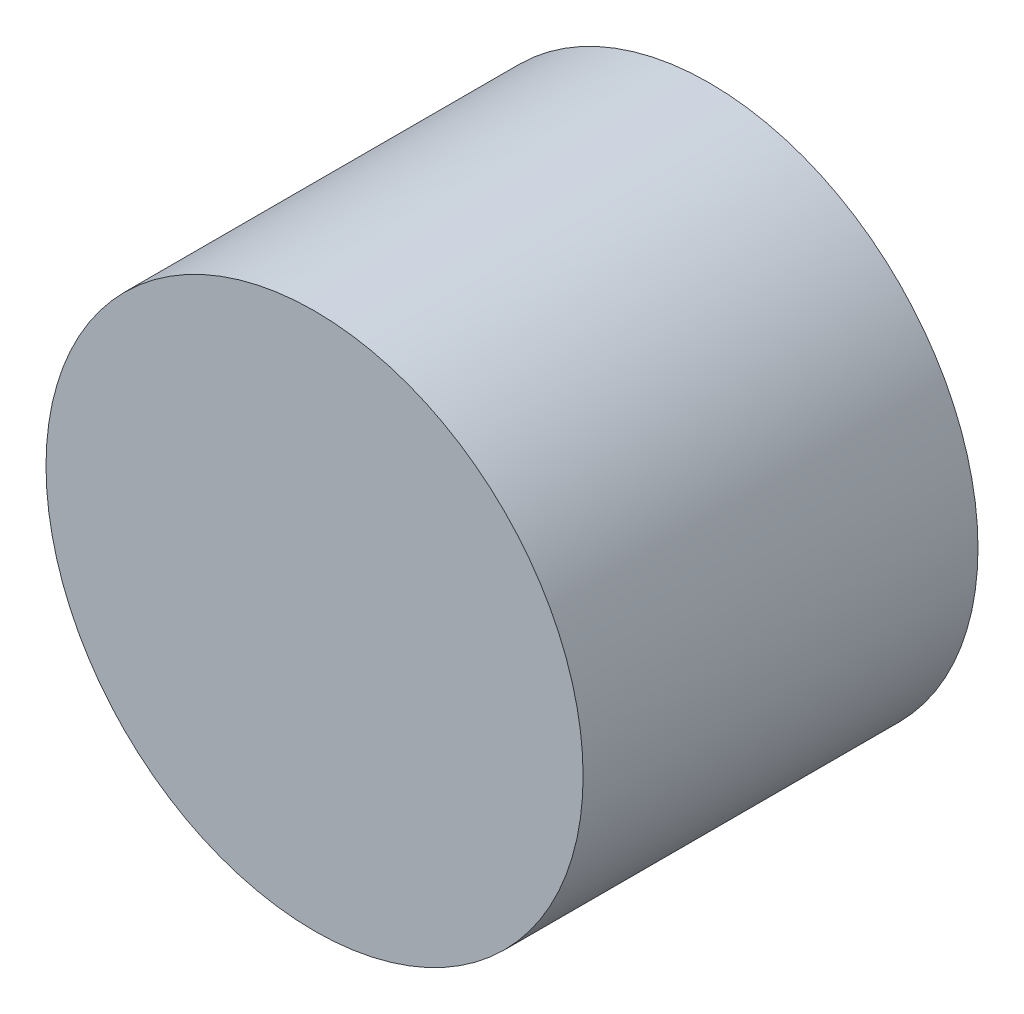
ISO-10303-21;
HEADER;
FILE_DESCRIPTION(('STEP AP214'),'2;1');
FILE_NAME('part.step','',(''),(''),'','','');
FILE_SCHEMA(('AUTOMOTIVE_DESIGN { 1 0 10303 214 1 1 1 1 }'));
ENDSEC;
DATA;
#1=APPLICATION_CONTEXT('core data for automotive mechanical design processes');
#2=APPLICATION_PROTOCOL_DEFINITION('international standard','automotive_design',2000,#1);
#3=PRODUCT_CONTEXT('',#1,'mechanical');
#4=PRODUCT('Part','Part','',(#3));
#5=PRODUCT_RELATED_PRODUCT_CATEGORY('part','',(#4));
#6=PRODUCT_DEFINITION_FORMATION('','',#4);
#7=PRODUCT_DEFINITION_CONTEXT('part definition',#1,'design');
#8=PRODUCT_DEFINITION('design','',#6,#7);
#9=PRODUCT_DEFINITION_SHAPE('','',#8);
#10=(LENGTH_UNIT() NAMED_UNIT(*) SI_UNIT(.MILLI.,.METRE.));
#11=(NAMED_UNIT(*) PLANE_ANGLE_UNIT() SI_UNIT($,.RADIAN.));
#12=(NAMED_UNIT(*) SI_UNIT($,.STERADIAN.) SOLID_ANGLE_UNIT());
#13=UNCERTAINTY_MEASURE_WITH_UNIT(LENGTH_MEASURE(1.E-05),#10,'distance_accuracy_value','');
#14=(GEOMETRIC_REPRESENTATION_CONTEXT(3) GLOBAL_UNCERTAINTY_ASSIGNED_CONTEXT((#13)) GLOBAL_UNIT_ASSIGNED_CONTEXT((#10,
#11,#12)) REPRESENTATION_CONTEXT('',''));
#15=CARTESIAN_POINT('',(0.,0.,0.));
#16=DIRECTION('',(0.,0.,1.));
#17=DIRECTION('',(1.,0.,0.));
#18=AXIS2_PLACEMENT_3D('',#15,#16,#17);
#19=CARTESIAN_POINT('',(6.787,-3.953,16.391));
#20=DIRECTION('',(0.,0.,-1.));
#21=DIRECTION('',(-1.,0.,0.));
#22=AXIS2_PLACEMENT_3D('',#19,#20,#21);
#23=CYLINDRICAL_SURFACE('',#22,11.147);
#24=CARTESIAN_POINT('',(6.787,-3.953,16.391));
#25=DIRECTION('',(0.,0.,1.));
#26=DIRECTION('',(1.,0.,0.));
#27=AXIS2_PLACEMENT_3D('',#24,#25,#26);
#28=CIRCLE('',#27,11.147);
#29=CARTESIAN_POINT('',(17.934,-3.953,16.391));
#30=VERTEX_POINT('',#29);
#31=EDGE_CURVE('E10',#30,#30,#28,.T.);
#32=ORIENTED_EDGE('',*,*,#31,.F.);
#33=EDGE_LOOP('',(#32));
#34=FACE_BOUND('',#33,.T.);
#35=CARTESIAN_POINT('',(6.787,-3.953,0.));
#36=DIRECTION('',(0.,0.,1.));
#37=DIRECTION('',(1.,0.,0.));
#38=AXIS2_PLACEMENT_3D('',#35,#36,#37);
#39=CIRCLE('',#38,11.147);
#40=CARTESIAN_POINT('',(17.934,-3.953,0.));
#41=VERTEX_POINT('',#40);
#42=EDGE_CURVE('E45',#41,#41,#39,.T.);
#43=ORIENTED_EDGE('',*,*,#42,.T.);
#44=EDGE_LOOP('',(#43));
#45=FACE_BOUND('',#44,.T.);
#46=ADVANCED_FACE('F39',(#34,#45),#23,.T.);
#47=CARTESIAN_POINT('',(6.787,-3.953,16.391));
#48=DIRECTION('',(0.,0.,1.));
#49=DIRECTION('',(1.,0.,0.));
#50=AXIS2_PLACEMENT_3D('',#47,#48,#49);
#51=PLANE('',#50);
#52=ORIENTED_EDGE('',*,*,#31,.T.);
#53=EDGE_LOOP('',(#52));
#54=FACE_BOUND('',#53,.T.);
#55=ADVANCED_FACE('F53',(#54),#51,.T.);
#56=CARTESIAN_POINT('',(6.787,-3.953,0.));
#57=DIRECTION('',(0.,0.,1.));
#58=DIRECTION('',(1.,0.,0.));
#59=AXIS2_PLACEMENT_3D('',#56,#57,#58);
#60=PLANE('',#59);
#61=ORIENTED_EDGE('',*,*,#42,.F.);
#62=EDGE_LOOP('',(#61));
#63=FACE_BOUND('',#62,.T.);
#64=ADVANCED_FACE('F55',(#63),#60,.F.);
#65=CLOSED_SHELL('',(#46,#55,#64));
#66=MANIFOLD_SOLID_BREP('B2',#65);
#67=ADVANCED_BREP_SHAPE_REPRESENTATION('',(#18,#66),#14);
#68=SHAPE_DEFINITION_REPRESENTATION(#9,#67);
ENDSEC;
END-ISO-10303-21;
